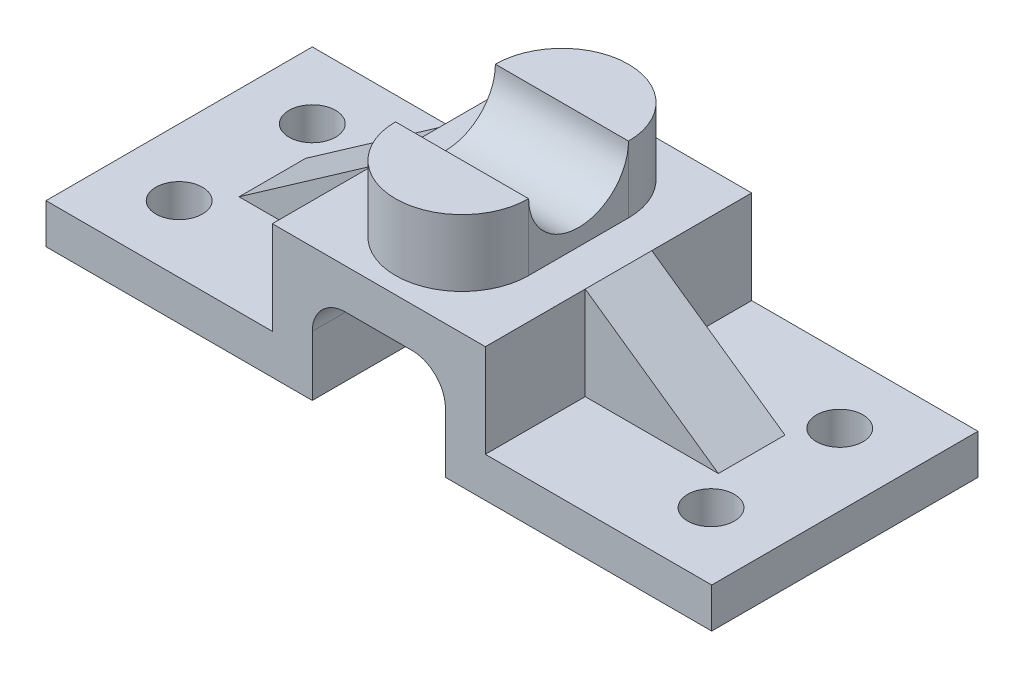
ISO-10303-21;
HEADER;
FILE_DESCRIPTION(('STEP AP214'),'2;1');
FILE_NAME('part.step','',(''),(''),'','','');
FILE_SCHEMA(('AUTOMOTIVE_DESIGN { 1 0 10303 214 1 1 1 1 }'));
ENDSEC;
DATA;
#1=APPLICATION_CONTEXT('core data for automotive mechanical design processes');
#2=APPLICATION_PROTOCOL_DEFINITION('international standard','automotive_design',2000,#1);
#3=PRODUCT_CONTEXT('',#1,'mechanical');
#4=PRODUCT('Part','Part','',(#3));
#5=PRODUCT_RELATED_PRODUCT_CATEGORY('part','',(#4));
#6=PRODUCT_DEFINITION_FORMATION('','',#4);
#7=PRODUCT_DEFINITION_CONTEXT('part definition',#1,'design');
#8=PRODUCT_DEFINITION('design','',#6,#7);
#9=PRODUCT_DEFINITION_SHAPE('','',#8);
#10=(LENGTH_UNIT() NAMED_UNIT(*) SI_UNIT(.MILLI.,.METRE.));
#11=(NAMED_UNIT(*) PLANE_ANGLE_UNIT() SI_UNIT($,.RADIAN.));
#12=(NAMED_UNIT(*) SI_UNIT($,.STERADIAN.) SOLID_ANGLE_UNIT());
#13=UNCERTAINTY_MEASURE_WITH_UNIT(LENGTH_MEASURE(1.E-05),#10,'distance_accuracy_value','');
#14=(GEOMETRIC_REPRESENTATION_CONTEXT(3) GLOBAL_UNCERTAINTY_ASSIGNED_CONTEXT((#13)) GLOBAL_UNIT_ASSIGNED_CONTEXT((#10,
#11,#12)) REPRESENTATION_CONTEXT('',''));
#15=CARTESIAN_POINT('',(0.,0.,0.));
#16=DIRECTION('',(0.,0.,1.));
#17=DIRECTION('',(1.,0.,0.));
#18=AXIS2_PLACEMENT_3D('',#15,#16,#17);
#19=CARTESIAN_POINT('',(-26.3205222580324,30.,-2.86009629086701));
#20=DIRECTION('',(0.,1.,0.));
#21=DIRECTION('',(0.,0.,1.));
#22=AXIS2_PLACEMENT_3D('',#19,#20,#21);
#23=PLANE('',#22);
#24=DIRECTION('',(1.,0.,0.));
#25=VECTOR('',#24,1.);
#26=CARTESIAN_POINT('',(-45.3205222580324,30.,12.139903709133));
#27=LINE('',#26,#25);
#28=CARTESIAN_POINT('',(-36.3205222580324,30.,12.139903709133));
#29=VERTEX_POINT('',#28);
#30=CARTESIAN_POINT('',(-16.3205222580324,30.,12.139903709133));
#31=VERTEX_POINT('',#30);
#32=EDGE_CURVE('E11',#29,#31,#27,.T.);
#33=ORIENTED_EDGE('',*,*,#32,.F.);
#34=CARTESIAN_POINT('',(-26.3205222580324,30.,12.139903709133));
#35=DIRECTION('',(0.,1.,0.));
#36=DIRECTION('',(0.,0.,1.));
#37=AXIS2_PLACEMENT_3D('',#34,#35,#36);
#38=CIRCLE('',#37,10.);
#39=EDGE_CURVE('E215',#29,#31,#38,.T.);
#40=ORIENTED_EDGE('',*,*,#39,.T.);
#41=EDGE_LOOP('',(#33,#40));
#42=FACE_BOUND('',#41,.T.);
#43=ADVANCED_FACE('F38',(#42),#23,.T.);
#44=CARTESIAN_POINT('',(-42.3205222580324,20.,0.));
#45=DIRECTION('',(-1.,0.,0.));
#46=DIRECTION('',(0.,0.,1.));
#47=AXIS2_PLACEMENT_3D('',#44,#45,#46);
#48=PLANE('',#47);
#49=DIRECTION('',(0.,0.,-1.));
#50=VECTOR('',#49,1.);
#51=CARTESIAN_POINT('',(-42.3205222580324,20.,0.));
#52=LINE('',#51,#50);
#53=CARTESIAN_POINT('',(-42.3205222580324,20.,24.639903709133));
#54=VERTEX_POINT('',#53);
#55=CARTESIAN_POINT('',(-42.3205222580324,20.,9.63990370913299));
#56=VERTEX_POINT('',#55);
#57=EDGE_CURVE('E305',#54,#56,#52,.T.);
#58=ORIENTED_EDGE('',*,*,#57,.T.);
#59=DIRECTION('',(0.,1.,0.));
#60=VECTOR('',#59,1.);
#61=CARTESIAN_POINT('',(-42.3205222580324,20.,9.63990370913299));
#62=LINE('',#61,#60);
#63=CARTESIAN_POINT('',(-42.3205222580324,6.,9.63990370913299));
#64=VERTEX_POINT('',#63);
#65=EDGE_CURVE('E231',#64,#56,#62,.T.);
#66=ORIENTED_EDGE('',*,*,#65,.F.);
#67=DIRECTION('',(0.,0.,-1.));
#68=VECTOR('',#67,1.);
#69=CARTESIAN_POINT('',(-42.3205222580324,6.,0.));
#70=LINE('',#69,#68);
#71=CARTESIAN_POINT('',(-42.3205222580324,6.,24.639903709133));
#72=VERTEX_POINT('',#71);
#73=EDGE_CURVE('E297',#72,#64,#70,.T.);
#74=ORIENTED_EDGE('',*,*,#73,.F.);
#75=DIRECTION('',(0.,-1.,0.));
#76=VECTOR('',#75,1.);
#77=CARTESIAN_POINT('',(-42.3205222580324,20.,24.639903709133));
#78=LINE('',#77,#76);
#79=EDGE_CURVE('E308',#54,#72,#78,.T.);
#80=ORIENTED_EDGE('',*,*,#79,.F.);
#81=EDGE_LOOP('',(#58,#66,#74,#80));
#82=FACE_BOUND('',#81,.T.);
#83=ADVANCED_FACE('F479',(#82),#48,.T.);
#84=CARTESIAN_POINT('',(0.,6.,0.));
#85=DIRECTION('',(0.,1.,0.));
#86=DIRECTION('',(0.,0.,1.));
#87=AXIS2_PLACEMENT_3D('',#84,#85,#86);
#88=PLANE('',#87);
#89=CARTESIAN_POINT('',(12.912927843922,6.,-5.36009629086701));
#90=DIRECTION('',(0.,1.,0.));
#91=DIRECTION('',(0.,0.,1.));
#92=AXIS2_PLACEMENT_3D('',#89,#90,#91);
#93=CIRCLE('',#92,3.5);
#94=CARTESIAN_POINT('',(12.912927843922,6.,-1.86009629086701));
#95=VERTEX_POINT('',#94);
#96=EDGE_CURVE('E333',#95,#95,#93,.T.);
#97=ORIENTED_EDGE('',*,*,#96,.F.);
#98=EDGE_LOOP('',(#97));
#99=FACE_BOUND('',#98,.T.);
#100=CARTESIAN_POINT('',(13.5739148649222,6.,14.639903709133));
#101=DIRECTION('',(0.,1.,0.));
#102=DIRECTION('',(0.,0.,1.));
#103=AXIS2_PLACEMENT_3D('',#100,#101,#102);
#104=CIRCLE('',#103,3.5);
#105=CARTESIAN_POINT('',(13.5739148649222,6.,18.139903709133));
#106=VERTEX_POINT('',#105);
#107=EDGE_CURVE('E327',#106,#106,#104,.T.);
#108=ORIENTED_EDGE('',*,*,#107,.F.);
#109=EDGE_LOOP('',(#108));
#110=FACE_BOUND('',#109,.T.);
#111=DIRECTION('',(0.,0.,-1.));
#112=VECTOR('',#111,1.);
#113=CARTESIAN_POINT('',(-10.3205222580324,6.,0.));
#114=LINE('',#113,#112);
#115=CARTESIAN_POINT('',(-10.3205222580324,6.,-0.360096290867007));
#116=VERTEX_POINT('',#115);
#117=CARTESIAN_POINT('',(-10.3205222580324,6.,-15.360096290867));
#118=VERTEX_POINT('',#117);
#119=EDGE_CURVE('E287',#116,#118,#114,.T.);
#120=ORIENTED_EDGE('',*,*,#119,.F.);
#121=DIRECTION('',(1.,0.,0.));
#122=VECTOR('',#121,1.);
#123=CARTESIAN_POINT('',(-10.3205222580324,6.,-0.360096290867007));
#124=LINE('',#123,#122);
#125=CARTESIAN_POINT('',(9.6794777419676,6.,-0.360096290867007));
#126=VERTEX_POINT('',#125);
#127=EDGE_CURVE('E257',#116,#126,#124,.T.);
#128=ORIENTED_EDGE('',*,*,#127,.T.);
#129=DIRECTION('',(0.,0.,1.));
#130=VECTOR('',#129,1.);
#131=CARTESIAN_POINT('',(9.6794777419676,6.,-0.360096290867007));
#132=LINE('',#131,#130);
#133=CARTESIAN_POINT('',(9.6794777419676,6.,9.63990370913299));
#134=VERTEX_POINT('',#133);
#135=EDGE_CURVE('E263',#126,#134,#132,.T.);
#136=ORIENTED_EDGE('',*,*,#135,.T.);
#137=DIRECTION('',(1.,0.,0.));
#138=VECTOR('',#137,1.);
#139=CARTESIAN_POINT('',(-10.3205222580324,6.,9.63990370913299));
#140=LINE('',#139,#138);
#141=CARTESIAN_POINT('',(-10.3205222580324,6.,9.63990370913299));
#142=VERTEX_POINT('',#141);
#143=EDGE_CURVE('E265',#142,#134,#140,.T.);
#144=ORIENTED_EDGE('',*,*,#143,.F.);
#145=CARTESIAN_POINT('',(-10.3205222580324,6.,24.639903709133));
#146=VERTEX_POINT('',#145);
#147=EDGE_CURVE('E309',#146,#142,#114,.T.);
#148=ORIENTED_EDGE('',*,*,#147,.F.);
#149=DIRECTION('',(1.,0.,0.));
#150=VECTOR('',#149,1.);
#151=CARTESIAN_POINT('',(-76.3205222580324,6.,24.639903709133));
#152=LINE('',#151,#150);
#153=CARTESIAN_POINT('',(23.6794777419676,6.,24.639903709133));
#154=VERTEX_POINT('',#153);
#155=EDGE_CURVE('E354',#146,#154,#152,.T.);
#156=ORIENTED_EDGE('',*,*,#155,.T.);
#157=DIRECTION('',(0.,0.,-1.));
#158=VECTOR('',#157,1.);
#159=CARTESIAN_POINT('',(23.6794777419676,6.,-15.360096290867));
#160=LINE('',#159,#158);
#161=CARTESIAN_POINT('',(23.6794777419676,6.,-15.360096290867));
#162=VERTEX_POINT('',#161);
#163=EDGE_CURVE('E358',#154,#162,#160,.T.);
#164=ORIENTED_EDGE('',*,*,#163,.T.);
#165=DIRECTION('',(-1.,0.,0.));
#166=VECTOR('',#165,1.);
#167=CARTESIAN_POINT('',(-76.3205222580324,6.,-15.360096290867));
#168=LINE('',#167,#166);
#169=EDGE_CURVE('E361',#162,#118,#168,.T.);
#170=ORIENTED_EDGE('',*,*,#169,.T.);
#171=EDGE_LOOP('',(#120,#128,#136,#144,#148,#156,#164,#170));
#172=FACE_BOUND('',#171,.T.);
#173=ADVANCED_FACE('F444',(#99,#110,#172),#88,.T.);
#174=CARTESIAN_POINT('',(-10.3205222580324,20.,0.));
#175=DIRECTION('',(-1.,0.,0.));
#176=DIRECTION('',(0.,0.,1.));
#177=AXIS2_PLACEMENT_3D('',#174,#175,#176);
#178=PLANE('',#177);
#179=DIRECTION('',(0.,-1.,0.));
#180=VECTOR('',#179,1.);
#181=CARTESIAN_POINT('',(-10.3205222580324,20.,-0.360096290867007));
#182=LINE('',#181,#180);
#183=CARTESIAN_POINT('',(-10.3205222580324,20.,-0.360096290867007));
#184=VERTEX_POINT('',#183);
#185=EDGE_CURVE('E254',#184,#116,#182,.T.);
#186=ORIENTED_EDGE('',*,*,#185,.T.);
#187=ORIENTED_EDGE('',*,*,#119,.T.);
#188=DIRECTION('',(0.,-1.,0.));
#189=VECTOR('',#188,1.);
#190=CARTESIAN_POINT('',(-10.3205222580324,20.,-15.360096290867));
#191=LINE('',#190,#189);
#192=CARTESIAN_POINT('',(-10.3205222580324,20.,-15.360096290867));
#193=VERTEX_POINT('',#192);
#194=EDGE_CURVE('E320',#193,#118,#191,.T.);
#195=ORIENTED_EDGE('',*,*,#194,.F.);
#196=DIRECTION('',(0.,0.,-1.));
#197=VECTOR('',#196,1.);
#198=CARTESIAN_POINT('',(-10.3205222580324,20.,0.));
#199=LINE('',#198,#197);
#200=EDGE_CURVE('E296',#184,#193,#199,.T.);
#201=ORIENTED_EDGE('',*,*,#200,.F.);
#202=EDGE_LOOP('',(#186,#187,#195,#201));
#203=FACE_BOUND('',#202,.T.);
#204=ADVANCED_FACE('F454',(#203),#178,.F.);
#205=CARTESIAN_POINT('',(0.,0.,0.));
#206=DIRECTION('',(0.,1.,0.));
#207=DIRECTION('',(0.,0.,1.));
#208=AXIS2_PLACEMENT_3D('',#205,#206,#207);
#209=PLANE('',#208);
#210=CARTESIAN_POINT('',(13.5739148649222,0.,14.639903709133));
#211=DIRECTION('',(0.,1.,0.));
#212=DIRECTION('',(0.,0.,1.));
#213=AXIS2_PLACEMENT_3D('',#210,#211,#212);
#214=CIRCLE('',#213,3.5);
#215=CARTESIAN_POINT('',(13.5739148649222,0.,18.139903709133));
#216=VERTEX_POINT('',#215);
#217=EDGE_CURVE('E326',#216,#216,#214,.T.);
#218=ORIENTED_EDGE('',*,*,#217,.T.);
#219=EDGE_LOOP('',(#218));
#220=FACE_BOUND('',#219,.T.);
#221=CARTESIAN_POINT('',(12.912927843922,0.,-5.36009629086701));
#222=DIRECTION('',(0.,1.,0.));
#223=DIRECTION('',(0.,0.,1.));
#224=AXIS2_PLACEMENT_3D('',#221,#222,#223);
#225=CIRCLE('',#224,3.5);
#226=CARTESIAN_POINT('',(12.912927843922,0.,-1.86009629086701));
#227=VERTEX_POINT('',#226);
#228=EDGE_CURVE('E330',#227,#227,#225,.T.);
#229=ORIENTED_EDGE('',*,*,#228,.T.);
#230=EDGE_LOOP('',(#229));
#231=FACE_BOUND('',#230,.T.);
#232=DIRECTION('',(1.,0.,0.));
#233=VECTOR('',#232,1.);
#234=CARTESIAN_POINT('',(-76.3205222580324,0.,24.639903709133));
#235=LINE('',#234,#233);
#236=CARTESIAN_POINT('',(-16.3205222580324,0.,24.639903709133));
#237=VERTEX_POINT('',#236);
#238=CARTESIAN_POINT('',(23.6794777419676,0.,24.639903709133));
#239=VERTEX_POINT('',#238);
#240=EDGE_CURVE('E367',#237,#239,#235,.T.);
#241=ORIENTED_EDGE('',*,*,#240,.F.);
#242=DIRECTION('',(0.,0.,1.));
#243=VECTOR('',#242,1.);
#244=CARTESIAN_POINT('',(-16.3205222580324,0.,-15.360096290867));
#245=LINE('',#244,#243);
#246=CARTESIAN_POINT('',(-16.3205222580324,0.,-15.360096290867));
#247=VERTEX_POINT('',#246);
#248=EDGE_CURVE('E277',#247,#237,#245,.T.);
#249=ORIENTED_EDGE('',*,*,#248,.F.);
#250=DIRECTION('',(-1.,0.,0.));
#251=VECTOR('',#250,1.);
#252=CARTESIAN_POINT('',(-76.3205222580324,0.,-15.360096290867));
#253=LINE('',#252,#251);
#254=CARTESIAN_POINT('',(23.6794777419676,0.,-15.360096290867));
#255=VERTEX_POINT('',#254);
#256=EDGE_CURVE('E355',#255,#247,#253,.T.);
#257=ORIENTED_EDGE('',*,*,#256,.F.);
#258=DIRECTION('',(0.,0.,-1.));
#259=VECTOR('',#258,1.);
#260=CARTESIAN_POINT('',(23.6794777419676,0.,-15.360096290867));
#261=LINE('',#260,#259);
#262=EDGE_CURVE('E371',#239,#255,#261,.T.);
#263=ORIENTED_EDGE('',*,*,#262,.F.);
#264=EDGE_LOOP('',(#241,#249,#257,#263));
#265=FACE_BOUND('',#264,.T.);
#266=ADVANCED_FACE('F514',(#220,#231,#265),#209,.F.);
#267=DIRECTION('',(1.,0.,0.));
#268=VECTOR('',#267,1.);
#269=CARTESIAN_POINT('',(-42.3205222580324,6.,-0.360096290867007));
#270=LINE('',#269,#268);
#271=CARTESIAN_POINT('',(-62.3205222580324,6.,-0.360096290867007));
#272=VERTEX_POINT('',#271);
#273=CARTESIAN_POINT('',(-42.3205222580324,6.,-0.360096290867007));
#274=VERTEX_POINT('',#273);
#275=EDGE_CURVE('E239',#272,#274,#270,.T.);
#276=ORIENTED_EDGE('',*,*,#275,.T.);
#277=CARTESIAN_POINT('',(-42.3205222580324,6.,-15.360096290867));
#278=VERTEX_POINT('',#277);
#279=EDGE_CURVE('E312',#274,#278,#70,.T.);
#280=ORIENTED_EDGE('',*,*,#279,.T.);
#281=CARTESIAN_POINT('',(-76.3205222580324,6.,-15.360096290867));
#282=VERTEX_POINT('',#281);
#283=EDGE_CURVE('E360',#278,#282,#168,.T.);
#284=ORIENTED_EDGE('',*,*,#283,.T.);
#285=DIRECTION('',(0.,0.,1.));
#286=VECTOR('',#285,1.);
#287=CARTESIAN_POINT('',(-76.3205222580324,6.,-15.360096290867));
#288=LINE('',#287,#286);
#289=CARTESIAN_POINT('',(-76.3205222580324,6.,24.639903709133));
#290=VERTEX_POINT('',#289);
#291=EDGE_CURVE('E351',#282,#290,#288,.T.);
#292=ORIENTED_EDGE('',*,*,#291,.T.);
#293=EDGE_CURVE('E356',#290,#72,#152,.T.);
#294=ORIENTED_EDGE('',*,*,#293,.T.);
#295=ORIENTED_EDGE('',*,*,#73,.T.);
#296=DIRECTION('',(1.,0.,0.));
#297=VECTOR('',#296,1.);
#298=CARTESIAN_POINT('',(-42.3205222580324,6.,9.63990370913299));
#299=LINE('',#298,#297);
#300=CARTESIAN_POINT('',(-62.3205222580324,6.,9.63990370913299));
#301=VERTEX_POINT('',#300);
#302=EDGE_CURVE('E236',#301,#64,#299,.T.);
#303=ORIENTED_EDGE('',*,*,#302,.F.);
#304=DIRECTION('',(0.,0.,1.));
#305=VECTOR('',#304,1.);
#306=CARTESIAN_POINT('',(-62.3205222580324,6.,-0.360096290867007));
#307=LINE('',#306,#305);
#308=EDGE_CURVE('E249',#272,#301,#307,.T.);
#309=ORIENTED_EDGE('',*,*,#308,.F.);
#310=EDGE_LOOP('',(#276,#280,#284,#292,#294,#295,#303,#309));
#311=FACE_BOUND('',#310,.T.);
#312=CARTESIAN_POINT('',(-66.3205222580324,6.,14.639903709133));
#313=DIRECTION('',(0.,1.,0.));
#314=DIRECTION('',(0.,0.,1.));
#315=AXIS2_PLACEMENT_3D('',#312,#313,#314);
#316=CIRCLE('',#315,3.50000000000001);
#317=CARTESIAN_POINT('',(-66.3205222580324,6.,18.139903709133));
#318=VERTEX_POINT('',#317);
#319=EDGE_CURVE('E339',#318,#318,#316,.T.);
#320=ORIENTED_EDGE('',*,*,#319,.F.);
#321=EDGE_LOOP('',(#320));
#322=FACE_BOUND('',#321,.T.);
#323=CARTESIAN_POINT('',(-66.3205222580324,6.,-5.36009629086701));
#324=DIRECTION('',(0.,1.,0.));
#325=DIRECTION('',(0.,0.,1.));
#326=AXIS2_PLACEMENT_3D('',#323,#324,#325);
#327=CIRCLE('',#326,3.50000000000001);
#328=CARTESIAN_POINT('',(-66.3205222580324,6.,-1.860096290867));
#329=VERTEX_POINT('',#328);
#330=EDGE_CURVE('E345',#329,#329,#327,.T.);
#331=ORIENTED_EDGE('',*,*,#330,.F.);
#332=EDGE_LOOP('',(#331));
#333=FACE_BOUND('',#332,.T.);
#334=ADVANCED_FACE('F473',(#311,#322,#333),#88,.T.);
#335=CARTESIAN_POINT('',(-36.3205222580324,0.,-15.360096290867));
#336=VERTEX_POINT('',#335);
#337=CARTESIAN_POINT('',(-76.3205222580324,0.,-15.360096290867));
#338=VERTEX_POINT('',#337);
#339=EDGE_CURVE('E373',#336,#338,#253,.T.);
#340=ORIENTED_EDGE('',*,*,#339,.F.);
#341=DIRECTION('',(0.,0.,-1.));
#342=VECTOR('',#341,1.);
#343=CARTESIAN_POINT('',(-36.3205222580324,0.,24.639903709133));
#344=LINE('',#343,#342);
#345=CARTESIAN_POINT('',(-36.3205222580324,0.,24.639903709133));
#346=VERTEX_POINT('',#345);
#347=EDGE_CURVE('E271',#346,#336,#344,.T.);
#348=ORIENTED_EDGE('',*,*,#347,.F.);
#349=CARTESIAN_POINT('',(-76.3205222580324,0.,24.639903709133));
#350=VERTEX_POINT('',#349);
#351=EDGE_CURVE('E368',#350,#346,#235,.T.);
#352=ORIENTED_EDGE('',*,*,#351,.F.);
#353=DIRECTION('',(0.,0.,1.));
#354=VECTOR('',#353,1.);
#355=CARTESIAN_POINT('',(-76.3205222580324,0.,-15.360096290867));
#356=LINE('',#355,#354);
#357=EDGE_CURVE('E348',#338,#350,#356,.T.);
#358=ORIENTED_EDGE('',*,*,#357,.F.);
#359=EDGE_LOOP('',(#340,#348,#352,#358));
#360=FACE_BOUND('',#359,.T.);
#361=CARTESIAN_POINT('',(-66.3205222580324,0.,-5.36009629086701));
#362=DIRECTION('',(0.,1.,0.));
#363=DIRECTION('',(0.,0.,1.));
#364=AXIS2_PLACEMENT_3D('',#361,#362,#363);
#365=CIRCLE('',#364,3.50000000000001);
#366=CARTESIAN_POINT('',(-66.3205222580324,0.,-1.860096290867));
#367=VERTEX_POINT('',#366);
#368=EDGE_CURVE('E342',#367,#367,#365,.T.);
#369=ORIENTED_EDGE('',*,*,#368,.T.);
#370=EDGE_LOOP('',(#369));
#371=FACE_BOUND('',#370,.T.);
#372=CARTESIAN_POINT('',(-66.3205222580324,0.,14.639903709133));
#373=DIRECTION('',(0.,1.,0.));
#374=DIRECTION('',(0.,0.,1.));
#375=AXIS2_PLACEMENT_3D('',#372,#373,#374);
#376=CIRCLE('',#375,3.50000000000001);
#377=CARTESIAN_POINT('',(-66.3205222580324,0.,18.139903709133));
#378=VERTEX_POINT('',#377);
#379=EDGE_CURVE('E336',#378,#378,#376,.T.);
#380=ORIENTED_EDGE('',*,*,#379,.T.);
#381=EDGE_LOOP('',(#380));
#382=FACE_BOUND('',#381,.T.);
#383=ADVANCED_FACE('F488',(#360,#371,#382),#209,.F.);
#384=CARTESIAN_POINT('',(-76.3205222580324,6.,-15.360096290867));
#385=DIRECTION('',(1.,0.,0.));
#386=DIRECTION('',(0.,0.,-1.));
#387=AXIS2_PLACEMENT_3D('',#384,#385,#386);
#388=PLANE('',#387);
#389=ORIENTED_EDGE('',*,*,#357,.T.);
#390=DIRECTION('',(0.,-1.,0.));
#391=VECTOR('',#390,1.);
#392=CARTESIAN_POINT('',(-76.3205222580324,6.,24.639903709133));
#393=LINE('',#392,#391);
#394=EDGE_CURVE('E384',#290,#350,#393,.T.);
#395=ORIENTED_EDGE('',*,*,#394,.F.);
#396=ORIENTED_EDGE('',*,*,#291,.F.);
#397=DIRECTION('',(0.,-1.,0.));
#398=VECTOR('',#397,1.);
#399=CARTESIAN_POINT('',(-76.3205222580324,6.,-15.360096290867));
#400=LINE('',#399,#398);
#401=EDGE_CURVE('E364',#282,#338,#400,.T.);
#402=ORIENTED_EDGE('',*,*,#401,.T.);
#403=EDGE_LOOP('',(#389,#395,#396,#402));
#404=FACE_BOUND('',#403,.T.);
#405=ADVANCED_FACE('F485',(#404),#388,.F.);
#406=CARTESIAN_POINT('',(-76.3205222580324,6.,24.639903709133));
#407=DIRECTION('',(0.,0.,-1.));
#408=DIRECTION('',(-1.,0.,0.));
#409=AXIS2_PLACEMENT_3D('',#406,#407,#408);
#410=PLANE('',#409);
#411=DIRECTION('',(-1.,0.,0.));
#412=VECTOR('',#411,1.);
#413=CARTESIAN_POINT('',(-16.3205222580324,14.,24.639903709133));
#414=LINE('',#413,#412);
#415=CARTESIAN_POINT('',(-21.3205222580324,14.,24.639903709133));
#416=VERTEX_POINT('',#415);
#417=CARTESIAN_POINT('',(-31.3205222580324,14.,24.639903709133));
#418=VERTEX_POINT('',#417);
#419=EDGE_CURVE('E274',#416,#418,#414,.T.);
#420=ORIENTED_EDGE('',*,*,#419,.F.);
#421=CARTESIAN_POINT('',(-21.3205222580324,9.,24.639903709133));
#422=DIRECTION('',(0.,0.,-1.));
#423=DIRECTION('',(-1.,0.,0.));
#424=AXIS2_PLACEMENT_3D('',#421,#422,#423);
#425=CIRCLE('',#424,5.);
#426=CARTESIAN_POINT('',(-16.3205222580324,9.,24.639903709133));
#427=VERTEX_POINT('',#426);
#428=EDGE_CURVE('E402',#416,#427,#425,.T.);
#429=ORIENTED_EDGE('',*,*,#428,.T.);
#430=DIRECTION('',(0.,-1.,0.));
#431=VECTOR('',#430,1.);
#432=CARTESIAN_POINT('',(-16.3205222580324,14.,24.639903709133));
#433=LINE('',#432,#431);
#434=EDGE_CURVE('E285',#427,#237,#433,.T.);
#435=ORIENTED_EDGE('',*,*,#434,.T.);
#436=ORIENTED_EDGE('',*,*,#240,.T.);
#437=DIRECTION('',(0.,-1.,0.));
#438=VECTOR('',#437,1.);
#439=CARTESIAN_POINT('',(23.6794777419676,6.,24.639903709133));
#440=LINE('',#439,#438);
#441=EDGE_CURVE('E381',#154,#239,#440,.T.);
#442=ORIENTED_EDGE('',*,*,#441,.F.);
#443=ORIENTED_EDGE('',*,*,#155,.F.);
#444=DIRECTION('',(0.,-1.,0.));
#445=VECTOR('',#444,1.);
#446=CARTESIAN_POINT('',(-10.3205222580324,20.,24.639903709133));
#447=LINE('',#446,#445);
#448=CARTESIAN_POINT('',(-10.3205222580324,20.,24.639903709133));
#449=VERTEX_POINT('',#448);
#450=EDGE_CURVE('E323',#449,#146,#447,.T.);
#451=ORIENTED_EDGE('',*,*,#450,.F.);
#452=DIRECTION('',(1.,0.,0.));
#453=VECTOR('',#452,1.);
#454=CARTESIAN_POINT('',(0.,20.,24.639903709133));
#455=LINE('',#454,#453);
#456=EDGE_CURVE('E293',#54,#449,#455,.T.);
#457=ORIENTED_EDGE('',*,*,#456,.F.);
#458=ORIENTED_EDGE('',*,*,#79,.T.);
#459=ORIENTED_EDGE('',*,*,#293,.F.);
#460=ORIENTED_EDGE('',*,*,#394,.T.);
#461=ORIENTED_EDGE('',*,*,#351,.T.);
#462=DIRECTION('',(0.,-1.,0.));
#463=VECTOR('',#462,1.);
#464=CARTESIAN_POINT('',(-36.3205222580324,14.,24.639903709133));
#465=LINE('',#464,#463);
#466=CARTESIAN_POINT('',(-36.3205222580324,9.,24.639903709133));
#467=VERTEX_POINT('',#466);
#468=EDGE_CURVE('E280',#467,#346,#465,.T.);
#469=ORIENTED_EDGE('',*,*,#468,.F.);
#470=CARTESIAN_POINT('',(-31.3205222580324,9.,24.639903709133));
#471=DIRECTION('',(0.,0.,-1.));
#472=DIRECTION('',(-1.,0.,0.));
#473=AXIS2_PLACEMENT_3D('',#470,#471,#472);
#474=CIRCLE('',#473,5.);
#475=EDGE_CURVE('E394',#467,#418,#474,.T.);
#476=ORIENTED_EDGE('',*,*,#475,.T.);
#477=EDGE_LOOP('',(#420,#429,#435,#436,#442,#443,#451,#457,#458,#459,#460,#461,#469,#476));
#478=FACE_BOUND('',#477,.T.);
#479=ADVANCED_FACE('F433',(#478),#410,.F.);
#480=CARTESIAN_POINT('',(23.6794777419676,6.,-15.360096290867));
#481=DIRECTION('',(-1.,0.,0.));
#482=DIRECTION('',(0.,0.,1.));
#483=AXIS2_PLACEMENT_3D('',#480,#481,#482);
#484=PLANE('',#483);
#485=ORIENTED_EDGE('',*,*,#262,.T.);
#486=DIRECTION('',(0.,-1.,0.));
#487=VECTOR('',#486,1.);
#488=CARTESIAN_POINT('',(23.6794777419676,6.,-15.360096290867));
#489=LINE('',#488,#487);
#490=EDGE_CURVE('E378',#162,#255,#489,.T.);
#491=ORIENTED_EDGE('',*,*,#490,.F.);
#492=ORIENTED_EDGE('',*,*,#163,.F.);
#493=ORIENTED_EDGE('',*,*,#441,.T.);
#494=EDGE_LOOP('',(#485,#491,#492,#493));
#495=FACE_BOUND('',#494,.T.);
#496=ADVANCED_FACE('F517',(#495),#484,.F.);
#497=CARTESIAN_POINT('',(-76.3205222580324,6.,-15.360096290867));
#498=DIRECTION('',(0.,0.,1.));
#499=DIRECTION('',(1.,0.,0.));
#500=AXIS2_PLACEMENT_3D('',#497,#498,#499);
#501=PLANE('',#500);
#502=ORIENTED_EDGE('',*,*,#256,.T.);
#503=DIRECTION('',(0.,-1.,0.));
#504=VECTOR('',#503,1.);
#505=CARTESIAN_POINT('',(-16.3205222580324,14.,-15.360096290867));
#506=LINE('',#505,#504);
#507=CARTESIAN_POINT('',(-16.3205222580324,9.,-15.360096290867));
#508=VERTEX_POINT('',#507);
#509=EDGE_CURVE('E288',#508,#247,#506,.T.);
#510=ORIENTED_EDGE('',*,*,#509,.F.);
#511=CARTESIAN_POINT('',(-21.3205222580324,9.,-15.360096290867));
#512=DIRECTION('',(0.,0.,1.));
#513=DIRECTION('',(1.,0.,0.));
#514=AXIS2_PLACEMENT_3D('',#511,#512,#513);
#515=CIRCLE('',#514,5.);
#516=CARTESIAN_POINT('',(-21.3205222580324,14.,-15.360096290867));
#517=VERTEX_POINT('',#516);
#518=EDGE_CURVE('E404',#508,#517,#515,.T.);
#519=ORIENTED_EDGE('',*,*,#518,.T.);
#520=DIRECTION('',(1.,0.,0.));
#521=VECTOR('',#520,1.);
#522=CARTESIAN_POINT('',(-36.3205222580324,14.,-15.360096290867));
#523=LINE('',#522,#521);
#524=CARTESIAN_POINT('',(-31.3205222580324,14.,-15.360096290867));
#525=VERTEX_POINT('',#524);
#526=EDGE_CURVE('E276',#525,#517,#523,.T.);
#527=ORIENTED_EDGE('',*,*,#526,.F.);
#528=CARTESIAN_POINT('',(-31.3205222580324,9.,-15.360096290867));
#529=DIRECTION('',(0.,0.,1.));
#530=DIRECTION('',(1.,0.,0.));
#531=AXIS2_PLACEMENT_3D('',#528,#529,#530);
#532=CIRCLE('',#531,5.);
#533=CARTESIAN_POINT('',(-36.3205222580324,9.,-15.360096290867));
#534=VERTEX_POINT('',#533);
#535=EDGE_CURVE('E392',#525,#534,#532,.T.);
#536=ORIENTED_EDGE('',*,*,#535,.T.);
#537=DIRECTION('',(0.,-1.,0.));
#538=VECTOR('',#537,1.);
#539=CARTESIAN_POINT('',(-36.3205222580324,14.,-15.360096290867));
#540=LINE('',#539,#538);
#541=EDGE_CURVE('E290',#534,#336,#540,.T.);
#542=ORIENTED_EDGE('',*,*,#541,.T.);
#543=ORIENTED_EDGE('',*,*,#339,.T.);
#544=ORIENTED_EDGE('',*,*,#401,.F.);
#545=ORIENTED_EDGE('',*,*,#283,.F.);
#546=DIRECTION('',(0.,-1.,0.));
#547=VECTOR('',#546,1.);
#548=CARTESIAN_POINT('',(-42.3205222580324,20.,-15.360096290867));
#549=LINE('',#548,#547);
#550=CARTESIAN_POINT('',(-42.3205222580324,20.,-15.360096290867));
#551=VERTEX_POINT('',#550);
#552=EDGE_CURVE('E317',#551,#278,#549,.T.);
#553=ORIENTED_EDGE('',*,*,#552,.F.);
#554=DIRECTION('',(-1.,0.,0.));
#555=VECTOR('',#554,1.);
#556=CARTESIAN_POINT('',(0.,20.,-15.360096290867));
#557=LINE('',#556,#555);
#558=EDGE_CURVE('E301',#193,#551,#557,.T.);
#559=ORIENTED_EDGE('',*,*,#558,.F.);
#560=ORIENTED_EDGE('',*,*,#194,.T.);
#561=ORIENTED_EDGE('',*,*,#169,.F.);
#562=ORIENTED_EDGE('',*,*,#490,.T.);
#563=EDGE_LOOP('',(#502,#510,#519,#527,#536,#542,#543,#544,#545,#553,#559,#560,#561,#562));
#564=FACE_BOUND('',#563,.T.);
#565=ADVANCED_FACE('F459',(#564),#501,.F.);
#566=CARTESIAN_POINT('',(-66.3205222580324,6.,-5.36009629086701));
#567=DIRECTION('',(0.,-1.,0.));
#568=DIRECTION('',(0.,0.,-1.));
#569=AXIS2_PLACEMENT_3D('',#566,#567,#568);
#570=CYLINDRICAL_SURFACE('',#569,3.50000000000001);
#571=ORIENTED_EDGE('',*,*,#330,.T.);
#572=EDGE_LOOP('',(#571));
#573=FACE_BOUND('',#572,.T.);
#574=ORIENTED_EDGE('',*,*,#368,.F.);
#575=EDGE_LOOP('',(#574));
#576=FACE_BOUND('',#575,.T.);
#577=ADVANCED_FACE('F526',(#573,#576),#570,.F.);
#578=CARTESIAN_POINT('',(-66.3205222580324,6.,14.639903709133));
#579=DIRECTION('',(0.,-1.,0.));
#580=DIRECTION('',(0.,0.,-1.));
#581=AXIS2_PLACEMENT_3D('',#578,#579,#580);
#582=CYLINDRICAL_SURFACE('',#581,3.50000000000001);
#583=ORIENTED_EDGE('',*,*,#319,.T.);
#584=EDGE_LOOP('',(#583));
#585=FACE_BOUND('',#584,.T.);
#586=ORIENTED_EDGE('',*,*,#379,.F.);
#587=EDGE_LOOP('',(#586));
#588=FACE_BOUND('',#587,.T.);
#589=ADVANCED_FACE('F579',(#585,#588),#582,.F.);
#590=CARTESIAN_POINT('',(12.912927843922,6.,-5.36009629086701));
#591=DIRECTION('',(0.,-1.,0.));
#592=DIRECTION('',(0.,0.,-1.));
#593=AXIS2_PLACEMENT_3D('',#590,#591,#592);
#594=CYLINDRICAL_SURFACE('',#593,3.5);
#595=ORIENTED_EDGE('',*,*,#96,.T.);
#596=EDGE_LOOP('',(#595));
#597=FACE_BOUND('',#596,.T.);
#598=ORIENTED_EDGE('',*,*,#228,.F.);
#599=EDGE_LOOP('',(#598));
#600=FACE_BOUND('',#599,.T.);
#601=ADVANCED_FACE('F575',(#597,#600),#594,.F.);
#602=CARTESIAN_POINT('',(13.5739148649222,6.,14.639903709133));
#603=DIRECTION('',(0.,-1.,0.));
#604=DIRECTION('',(0.,0.,-1.));
#605=AXIS2_PLACEMENT_3D('',#602,#603,#604);
#606=CYLINDRICAL_SURFACE('',#605,3.5);
#607=ORIENTED_EDGE('',*,*,#107,.T.);
#608=EDGE_LOOP('',(#607));
#609=FACE_BOUND('',#608,.T.);
#610=ORIENTED_EDGE('',*,*,#217,.F.);
#611=EDGE_LOOP('',(#610));
#612=FACE_BOUND('',#611,.T.);
#613=ADVANCED_FACE('F572',(#609,#612),#606,.F.);
#614=ORIENTED_EDGE('',*,*,#147,.T.);
#615=DIRECTION('',(0.,-1.,0.));
#616=VECTOR('',#615,1.);
#617=CARTESIAN_POINT('',(-10.3205222580324,20.,9.63990370913299));
#618=LINE('',#617,#616);
#619=CARTESIAN_POINT('',(-10.3205222580324,20.,9.63990370913299));
#620=VERTEX_POINT('',#619);
#621=EDGE_CURVE('E252',#620,#142,#618,.T.);
#622=ORIENTED_EDGE('',*,*,#621,.F.);
#623=EDGE_CURVE('E298',#449,#620,#199,.T.);
#624=ORIENTED_EDGE('',*,*,#623,.F.);
#625=ORIENTED_EDGE('',*,*,#450,.T.);
#626=EDGE_LOOP('',(#614,#622,#624,#625));
#627=FACE_BOUND('',#626,.T.);
#628=ADVANCED_FACE('F436',(#627),#178,.F.);
#629=DIRECTION('',(0.,1.,0.));
#630=VECTOR('',#629,1.);
#631=CARTESIAN_POINT('',(-42.3205222580324,20.,-0.360096290867007));
#632=LINE('',#631,#630);
#633=CARTESIAN_POINT('',(-42.3205222580324,20.,-0.360096290867007));
#634=VERTEX_POINT('',#633);
#635=EDGE_CURVE('E232',#274,#634,#632,.T.);
#636=ORIENTED_EDGE('',*,*,#635,.T.);
#637=EDGE_CURVE('E304',#634,#551,#52,.T.);
#638=ORIENTED_EDGE('',*,*,#637,.T.);
#639=ORIENTED_EDGE('',*,*,#552,.T.);
#640=ORIENTED_EDGE('',*,*,#279,.F.);
#641=EDGE_LOOP('',(#636,#638,#639,#640));
#642=FACE_BOUND('',#641,.T.);
#643=ADVANCED_FACE('F424',(#642),#48,.T.);
#644=CARTESIAN_POINT('',(0.,20.,0.));
#645=DIRECTION('',(0.,1.,0.));
#646=DIRECTION('',(0.,0.,1.));
#647=AXIS2_PLACEMENT_3D('',#644,#645,#646);
#648=PLANE('',#647);
#649=CARTESIAN_POINT('',(-26.3205222580324,20.,-2.86009629086701));
#650=DIRECTION('',(0.,1.,0.));
#651=DIRECTION('',(0.,0.,1.));
#652=AXIS2_PLACEMENT_3D('',#649,#650,#651);
#653=CIRCLE('',#652,10.);
#654=CARTESIAN_POINT('',(-16.3205222580324,20.,-2.86009629086701));
#655=VERTEX_POINT('',#654);
#656=CARTESIAN_POINT('',(-36.3205222580324,20.,-2.860096290867));
#657=VERTEX_POINT('',#656);
#658=EDGE_CURVE('E53',#655,#657,#653,.T.);
#659=ORIENTED_EDGE('',*,*,#658,.F.);
#660=DIRECTION('',(0.,0.,-1.));
#661=VECTOR('',#660,1.);
#662=CARTESIAN_POINT('',(-16.3205222580324,20.,-2.86009629086701));
#663=LINE('',#662,#661);
#664=CARTESIAN_POINT('',(-16.3205222580324,20.,12.139903709133));
#665=VERTEX_POINT('',#664);
#666=EDGE_CURVE('E57',#665,#655,#663,.T.);
#667=ORIENTED_EDGE('',*,*,#666,.F.);
#668=CARTESIAN_POINT('',(-26.3205222580324,20.,12.139903709133));
#669=DIRECTION('',(0.,1.,0.));
#670=DIRECTION('',(0.,0.,1.));
#671=AXIS2_PLACEMENT_3D('',#668,#669,#670);
#672=CIRCLE('',#671,10.);
#673=CARTESIAN_POINT('',(-36.3205222580324,20.,12.139903709133));
#674=VERTEX_POINT('',#673);
#675=EDGE_CURVE('E221',#674,#665,#672,.T.);
#676=ORIENTED_EDGE('',*,*,#675,.F.);
#677=DIRECTION('',(0.,0.,1.));
#678=VECTOR('',#677,1.);
#679=CARTESIAN_POINT('',(-36.3205222580324,20.,-2.860096290867));
#680=LINE('',#679,#678);
#681=EDGE_CURVE('E416',#657,#674,#680,.T.);
#682=ORIENTED_EDGE('',*,*,#681,.F.);
#683=EDGE_LOOP('',(#659,#667,#676,#682));
#684=FACE_BOUND('',#683,.T.);
#685=ORIENTED_EDGE('',*,*,#456,.T.);
#686=ORIENTED_EDGE('',*,*,#623,.T.);
#687=DIRECTION('',(0.,0.,1.));
#688=VECTOR('',#687,1.);
#689=CARTESIAN_POINT('',(-10.3205222580324,20.,-0.360096290867007));
#690=LINE('',#689,#688);
#691=EDGE_CURVE('E269',#184,#620,#690,.T.);
#692=ORIENTED_EDGE('',*,*,#691,.F.);
#693=ORIENTED_EDGE('',*,*,#200,.T.);
#694=ORIENTED_EDGE('',*,*,#558,.T.);
#695=ORIENTED_EDGE('',*,*,#637,.F.);
#696=DIRECTION('',(0.,0.,1.));
#697=VECTOR('',#696,1.);
#698=CARTESIAN_POINT('',(-42.3205222580324,20.,-0.360096290867007));
#699=LINE('',#698,#697);
#700=EDGE_CURVE('E241',#634,#56,#699,.T.);
#701=ORIENTED_EDGE('',*,*,#700,.T.);
#702=ORIENTED_EDGE('',*,*,#57,.F.);
#703=EDGE_LOOP('',(#685,#686,#692,#693,#694,#695,#701,#702));
#704=FACE_BOUND('',#703,.T.);
#705=ADVANCED_FACE('F420',(#684,#704),#648,.T.);
#706=CARTESIAN_POINT('',(-16.3205222580324,14.,-15.360096290867));
#707=DIRECTION('',(1.,0.,0.));
#708=DIRECTION('',(0.,0.,-1.));
#709=AXIS2_PLACEMENT_3D('',#706,#707,#708);
#710=PLANE('',#709);
#711=ORIENTED_EDGE('',*,*,#434,.F.);
#712=DIRECTION('',(0.,0.,1.));
#713=VECTOR('',#712,1.);
#714=CARTESIAN_POINT('',(-16.3205222580324,9.,-15.360096290867));
#715=LINE('',#714,#713);
#716=EDGE_CURVE('E400',#427,#508,#715,.F.);
#717=ORIENTED_EDGE('',*,*,#716,.T.);
#718=ORIENTED_EDGE('',*,*,#509,.T.);
#719=ORIENTED_EDGE('',*,*,#248,.T.);
#720=EDGE_LOOP('',(#711,#717,#718,#719));
#721=FACE_BOUND('',#720,.T.);
#722=ADVANCED_FACE('F423',(#721),#710,.F.);
#723=CARTESIAN_POINT('',(-36.3205222580324,14.,24.639903709133));
#724=DIRECTION('',(-1.,0.,0.));
#725=DIRECTION('',(0.,0.,1.));
#726=AXIS2_PLACEMENT_3D('',#723,#724,#725);
#727=PLANE('',#726);
#728=ORIENTED_EDGE('',*,*,#541,.F.);
#729=DIRECTION('',(0.,0.,-1.));
#730=VECTOR('',#729,1.);
#731=CARTESIAN_POINT('',(-36.3205222580324,9.,24.639903709133));
#732=LINE('',#731,#730);
#733=EDGE_CURVE('E390',#534,#467,#732,.F.);
#734=ORIENTED_EDGE('',*,*,#733,.T.);
#735=ORIENTED_EDGE('',*,*,#468,.T.);
#736=ORIENTED_EDGE('',*,*,#347,.T.);
#737=EDGE_LOOP('',(#728,#734,#735,#736));
#738=FACE_BOUND('',#737,.T.);
#739=ADVANCED_FACE('F493',(#738),#727,.F.);
#740=CARTESIAN_POINT('',(0.,14.,0.));
#741=DIRECTION('',(0.,-1.,0.));
#742=DIRECTION('',(0.,0.,-1.));
#743=AXIS2_PLACEMENT_3D('',#740,#741,#742);
#744=PLANE('',#743);
#745=ORIENTED_EDGE('',*,*,#526,.T.);
#746=DIRECTION('',(0.,0.,1.));
#747=VECTOR('',#746,1.);
#748=CARTESIAN_POINT('',(-21.3205222580324,14.,0.));
#749=LINE('',#748,#747);
#750=EDGE_CURVE('E397',#517,#416,#749,.T.);
#751=ORIENTED_EDGE('',*,*,#750,.T.);
#752=ORIENTED_EDGE('',*,*,#419,.T.);
#753=DIRECTION('',(0.,0.,-1.));
#754=VECTOR('',#753,1.);
#755=CARTESIAN_POINT('',(-31.3205222580324,14.,0.));
#756=LINE('',#755,#754);
#757=EDGE_CURVE('E387',#418,#525,#756,.T.);
#758=ORIENTED_EDGE('',*,*,#757,.T.);
#759=EDGE_LOOP('',(#745,#751,#752,#758));
#760=FACE_BOUND('',#759,.T.);
#761=ADVANCED_FACE('F501',(#760),#744,.T.);
#762=CARTESIAN_POINT('',(-31.3205222580324,9.,0.));
#763=DIRECTION('',(0.,0.,-1.));
#764=DIRECTION('',(-1.,0.,0.));
#765=AXIS2_PLACEMENT_3D('',#762,#763,#764);
#766=CYLINDRICAL_SURFACE('',#765,5.);
#767=ORIENTED_EDGE('',*,*,#475,.F.);
#768=ORIENTED_EDGE('',*,*,#733,.F.);
#769=ORIENTED_EDGE('',*,*,#535,.F.);
#770=ORIENTED_EDGE('',*,*,#757,.F.);
#771=EDGE_LOOP('',(#767,#768,#769,#770));
#772=FACE_BOUND('',#771,.T.);
#773=ADVANCED_FACE('F498',(#772),#766,.F.);
#774=CARTESIAN_POINT('',(-21.3205222580324,9.,0.));
#775=DIRECTION('',(0.,0.,1.));
#776=DIRECTION('',(1.,0.,0.));
#777=AXIS2_PLACEMENT_3D('',#774,#775,#776);
#778=CYLINDRICAL_SURFACE('',#777,5.);
#779=ORIENTED_EDGE('',*,*,#518,.F.);
#780=ORIENTED_EDGE('',*,*,#716,.F.);
#781=ORIENTED_EDGE('',*,*,#428,.F.);
#782=ORIENTED_EDGE('',*,*,#750,.F.);
#783=EDGE_LOOP('',(#779,#780,#781,#782));
#784=FACE_BOUND('',#783,.T.);
#785=ADVANCED_FACE('F40',(#784),#778,.F.);
#786=CARTESIAN_POINT('',(9.6794777419676,6.,-0.360096290867007));
#787=DIRECTION('',(0.573462344363328,0.81923192051904,0.));
#788=DIRECTION('',(-0.81923192051904,0.573462344363328,0.));
#789=AXIS2_PLACEMENT_3D('',#786,#787,#788);
#790=PLANE('',#789);
#791=DIRECTION('',(-0.81923192051904,0.573462344363328,0.));
#792=VECTOR('',#791,1.);
#793=CARTESIAN_POINT('',(9.6794777419676,6.,9.63990370913299));
#794=LINE('',#793,#792);
#795=EDGE_CURVE('E258',#134,#620,#794,.T.);
#796=ORIENTED_EDGE('',*,*,#795,.F.);
#797=ORIENTED_EDGE('',*,*,#135,.F.);
#798=DIRECTION('',(-0.81923192051904,0.573462344363328,0.));
#799=VECTOR('',#798,1.);
#800=CARTESIAN_POINT('',(9.6794777419676,6.,-0.360096290867007));
#801=LINE('',#800,#799);
#802=EDGE_CURVE('E261',#126,#184,#801,.T.);
#803=ORIENTED_EDGE('',*,*,#802,.T.);
#804=ORIENTED_EDGE('',*,*,#691,.T.);
#805=EDGE_LOOP('',(#796,#797,#803,#804));
#806=FACE_BOUND('',#805,.T.);
#807=ADVANCED_FACE('F447',(#806),#790,.T.);
#808=CARTESIAN_POINT('',(0.,0.,-0.360096290867007));
#809=DIRECTION('',(0.,0.,1.));
#810=DIRECTION('',(1.,0.,0.));
#811=AXIS2_PLACEMENT_3D('',#808,#809,#810);
#812=PLANE('',#811);
#813=ORIENTED_EDGE('',*,*,#185,.F.);
#814=ORIENTED_EDGE('',*,*,#802,.F.);
#815=ORIENTED_EDGE('',*,*,#127,.F.);
#816=EDGE_LOOP('',(#813,#814,#815));
#817=FACE_BOUND('',#816,.T.);
#818=ADVANCED_FACE('F450',(#817),#812,.F.);
#819=CARTESIAN_POINT('',(0.,0.,9.63990370913299));
#820=DIRECTION('',(0.,0.,1.));
#821=DIRECTION('',(1.,0.,0.));
#822=AXIS2_PLACEMENT_3D('',#819,#820,#821);
#823=PLANE('',#822);
#824=ORIENTED_EDGE('',*,*,#621,.T.);
#825=ORIENTED_EDGE('',*,*,#143,.T.);
#826=ORIENTED_EDGE('',*,*,#795,.T.);
#827=EDGE_LOOP('',(#824,#825,#826));
#828=FACE_BOUND('',#827,.T.);
#829=ADVANCED_FACE('F440',(#828),#823,.T.);
#830=CARTESIAN_POINT('',(-62.3205222580324,6.,-0.360096290867007));
#831=DIRECTION('',(-0.573462344363328,0.819231920519041,0.));
#832=DIRECTION('',(-0.819231920519041,-0.573462344363328,0.));
#833=AXIS2_PLACEMENT_3D('',#830,#831,#832);
#834=PLANE('',#833);
#835=DIRECTION('',(-0.819231920519041,-0.573462344363328,0.));
#836=VECTOR('',#835,1.);
#837=CARTESIAN_POINT('',(-62.3205222580324,6.,9.63990370913299));
#838=LINE('',#837,#836);
#839=EDGE_CURVE('E244',#56,#301,#838,.T.);
#840=ORIENTED_EDGE('',*,*,#839,.F.);
#841=ORIENTED_EDGE('',*,*,#700,.F.);
#842=DIRECTION('',(-0.819231920519041,-0.573462344363328,0.));
#843=VECTOR('',#842,1.);
#844=CARTESIAN_POINT('',(-62.3205222580324,6.,-0.360096290867007));
#845=LINE('',#844,#843);
#846=EDGE_CURVE('E235',#634,#272,#845,.T.);
#847=ORIENTED_EDGE('',*,*,#846,.T.);
#848=ORIENTED_EDGE('',*,*,#308,.T.);
#849=EDGE_LOOP('',(#840,#841,#847,#848));
#850=FACE_BOUND('',#849,.T.);
#851=ADVANCED_FACE('F470',(#850),#834,.T.);
#852=CARTESIAN_POINT('',(0.,0.,-0.360096290867007));
#853=DIRECTION('',(0.,0.,-1.));
#854=DIRECTION('',(-1.,0.,0.));
#855=AXIS2_PLACEMENT_3D('',#852,#853,#854);
#856=PLANE('',#855);
#857=ORIENTED_EDGE('',*,*,#635,.F.);
#858=ORIENTED_EDGE('',*,*,#275,.F.);
#859=ORIENTED_EDGE('',*,*,#846,.F.);
#860=EDGE_LOOP('',(#857,#858,#859));
#861=FACE_BOUND('',#860,.T.);
#862=ADVANCED_FACE('F471',(#861),#856,.T.);
#863=CARTESIAN_POINT('',(0.,0.,9.63990370913299));
#864=DIRECTION('',(0.,0.,-1.));
#865=DIRECTION('',(-1.,0.,0.));
#866=AXIS2_PLACEMENT_3D('',#863,#864,#865);
#867=PLANE('',#866);
#868=ORIENTED_EDGE('',*,*,#65,.T.);
#869=ORIENTED_EDGE('',*,*,#839,.T.);
#870=ORIENTED_EDGE('',*,*,#302,.T.);
#871=EDGE_LOOP('',(#868,#869,#870));
#872=FACE_BOUND('',#871,.T.);
#873=ADVANCED_FACE('F476',(#872),#867,.F.);
#874=CARTESIAN_POINT('',(-26.3205222580324,30.,-2.86009629086701));
#875=DIRECTION('',(0.,-1.,0.));
#876=DIRECTION('',(0.,0.,-1.));
#877=AXIS2_PLACEMENT_3D('',#874,#875,#876);
#878=CYLINDRICAL_SURFACE('',#877,10.);
#879=ORIENTED_EDGE('',*,*,#658,.T.);
#880=DIRECTION('',(0.,-1.,0.));
#881=VECTOR('',#880,1.);
#882=CARTESIAN_POINT('',(-36.3205222580324,30.,-2.860096290867));
#883=LINE('',#882,#881);
#884=CARTESIAN_POINT('',(-36.3205222580324,30.,-2.860096290867));
#885=VERTEX_POINT('',#884);
#886=EDGE_CURVE('E224',#885,#657,#883,.T.);
#887=ORIENTED_EDGE('',*,*,#886,.F.);
#888=CARTESIAN_POINT('',(-26.3205222580324,30.,-2.86009629086701));
#889=DIRECTION('',(0.,1.,0.));
#890=DIRECTION('',(0.,0.,1.));
#891=AXIS2_PLACEMENT_3D('',#888,#889,#890);
#892=CIRCLE('',#891,10.);
#893=CARTESIAN_POINT('',(-16.3205222580324,30.,-2.86009629086701));
#894=VERTEX_POINT('',#893);
#895=EDGE_CURVE('E218',#894,#885,#892,.T.);
#896=ORIENTED_EDGE('',*,*,#895,.F.);
#897=DIRECTION('',(0.,-1.,0.));
#898=VECTOR('',#897,1.);
#899=CARTESIAN_POINT('',(-16.3205222580324,30.,-2.86009629086701));
#900=LINE('',#899,#898);
#901=EDGE_CURVE('E211',#894,#655,#900,.T.);
#902=ORIENTED_EDGE('',*,*,#901,.T.);
#903=EDGE_LOOP('',(#879,#887,#896,#902));
#904=FACE_BOUND('',#903,.T.);
#905=ADVANCED_FACE('F415',(#904),#878,.T.);
#906=CARTESIAN_POINT('',(-36.3205222580324,30.,-2.860096290867));
#907=DIRECTION('',(1.,0.,0.));
#908=DIRECTION('',(0.,0.,-1.));
#909=AXIS2_PLACEMENT_3D('',#906,#907,#908);
#910=PLANE('',#909);
#911=DIRECTION('',(0.,-1.,0.));
#912=VECTOR('',#911,1.);
#913=CARTESIAN_POINT('',(-36.3205222580324,30.,12.139903709133));
#914=LINE('',#913,#912);
#915=EDGE_CURVE('E222',#29,#674,#914,.T.);
#916=ORIENTED_EDGE('',*,*,#915,.F.);
#917=CARTESIAN_POINT('',(-36.3205222580324,30.,4.639903709133));
#918=DIRECTION('',(1.,0.,0.));
#919=DIRECTION('',(0.,0.,-1.));
#920=AXIS2_PLACEMENT_3D('',#917,#918,#919);
#921=CIRCLE('',#920,7.5);
#922=EDGE_CURVE('E200',#29,#885,#921,.T.);
#923=ORIENTED_EDGE('',*,*,#922,.T.);
#924=ORIENTED_EDGE('',*,*,#886,.T.);
#925=ORIENTED_EDGE('',*,*,#681,.T.);
#926=EDGE_LOOP('',(#916,#923,#924,#925));
#927=FACE_BOUND('',#926,.T.);
#928=ADVANCED_FACE('F408',(#927),#910,.F.);
#929=CARTESIAN_POINT('',(-26.3205222580324,30.,12.139903709133));
#930=DIRECTION('',(0.,-1.,0.));
#931=DIRECTION('',(0.,0.,-1.));
#932=AXIS2_PLACEMENT_3D('',#929,#930,#931);
#933=CYLINDRICAL_SURFACE('',#932,10.);
#934=ORIENTED_EDGE('',*,*,#675,.T.);
#935=DIRECTION('',(0.,-1.,0.));
#936=VECTOR('',#935,1.);
#937=CARTESIAN_POINT('',(-16.3205222580324,30.,12.139903709133));
#938=LINE('',#937,#936);
#939=EDGE_CURVE('E209',#31,#665,#938,.T.);
#940=ORIENTED_EDGE('',*,*,#939,.F.);
#941=ORIENTED_EDGE('',*,*,#39,.F.);
#942=ORIENTED_EDGE('',*,*,#915,.T.);
#943=EDGE_LOOP('',(#934,#940,#941,#942));
#944=FACE_BOUND('',#943,.T.);
#945=ADVANCED_FACE('F220',(#944),#933,.T.);
#946=CARTESIAN_POINT('',(-16.3205222580324,30.,-2.86009629086701));
#947=DIRECTION('',(-1.,0.,0.));
#948=DIRECTION('',(0.,0.,1.));
#949=AXIS2_PLACEMENT_3D('',#946,#947,#948);
#950=PLANE('',#949);
#951=ORIENTED_EDGE('',*,*,#901,.F.);
#952=CARTESIAN_POINT('',(-16.3205222580324,30.,4.63990370913299));
#953=DIRECTION('',(1.,0.,0.));
#954=DIRECTION('',(0.,0.,-1.));
#955=AXIS2_PLACEMENT_3D('',#952,#953,#954);
#956=CIRCLE('',#955,7.5);
#957=EDGE_CURVE('E197',#31,#894,#956,.T.);
#958=ORIENTED_EDGE('',*,*,#957,.F.);
#959=ORIENTED_EDGE('',*,*,#939,.T.);
#960=ORIENTED_EDGE('',*,*,#666,.T.);
#961=EDGE_LOOP('',(#951,#958,#959,#960));
#962=FACE_BOUND('',#961,.T.);
#963=ADVANCED_FACE('F207',(#962),#950,.F.);
#964=DIRECTION('',(1.,0.,0.));
#965=VECTOR('',#964,1.);
#966=CARTESIAN_POINT('',(-45.3205222580324,30.,-2.860096290867));
#967=LINE('',#966,#965);
#968=EDGE_CURVE('E46',#894,#885,#967,.F.);
#969=ORIENTED_EDGE('',*,*,#968,.F.);
#970=ORIENTED_EDGE('',*,*,#895,.T.);
#971=EDGE_LOOP('',(#969,#970));
#972=FACE_BOUND('',#971,.T.);
#973=ADVANCED_FACE('F412',(#972),#23,.T.);
#974=CARTESIAN_POINT('',(-45.3205222580324,30.,4.639903709133));
#975=DIRECTION('',(1.,0.,0.));
#976=DIRECTION('',(0.,0.,-1.));
#977=AXIS2_PLACEMENT_3D('',#974,#975,#976);
#978=CYLINDRICAL_SURFACE('',#977,7.5);
#979=ORIENTED_EDGE('',*,*,#32,.T.);
#980=ORIENTED_EDGE('',*,*,#957,.T.);
#981=ORIENTED_EDGE('',*,*,#968,.T.);
#982=ORIENTED_EDGE('',*,*,#922,.F.);
#983=EDGE_LOOP('',(#979,#980,#981,#982));
#984=FACE_BOUND('',#983,.T.);
#985=ADVANCED_FACE('F196',(#984),#978,.F.);
#986=CLOSED_SHELL('',(#43,#83,#173,#204,#266,#334,#383,#405,#479,#496,#565,#577,#589,#601,#613,
#628,#643,#705,#722,#739,#761,#773,#785,#807,#818,#829,#851,#862,#873,#905,#928,#945,#963,#973,#985));
#987=MANIFOLD_SOLID_BREP('B2',#986);
#988=ADVANCED_BREP_SHAPE_REPRESENTATION('',(#18,#987),#14);
#989=SHAPE_DEFINITION_REPRESENTATION(#9,#988);
ENDSEC;
END-ISO-10303-21;
